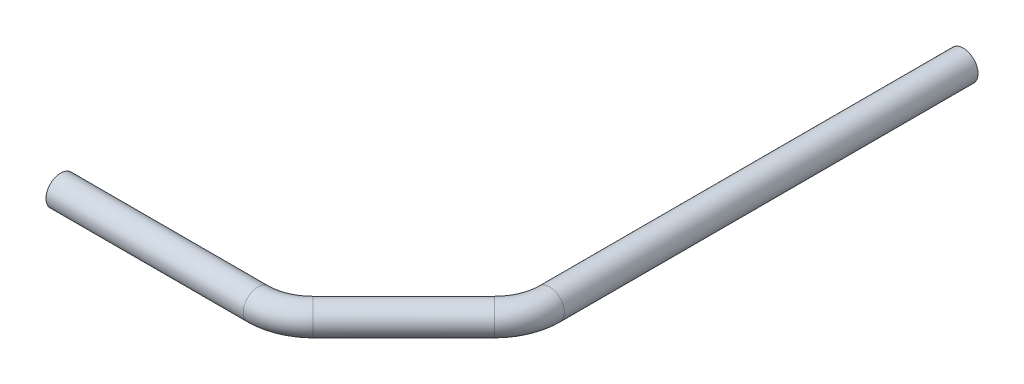
ISO-10303-21;
HEADER;
FILE_DESCRIPTION(('STEP AP214'),'2;1');
FILE_NAME('part.step','',(''),(''),'','','');
FILE_SCHEMA(('AUTOMOTIVE_DESIGN { 1 0 10303 214 1 1 1 1 }'));
ENDSEC;
DATA;
#1=APPLICATION_CONTEXT('core data for automotive mechanical design processes');
#2=APPLICATION_PROTOCOL_DEFINITION('international standard','automotive_design',2000,#1);
#3=PRODUCT_CONTEXT('',#1,'mechanical');
#4=PRODUCT('Part','Part','',(#3));
#5=PRODUCT_RELATED_PRODUCT_CATEGORY('part','',(#4));
#6=PRODUCT_DEFINITION_FORMATION('','',#4);
#7=PRODUCT_DEFINITION_CONTEXT('part definition',#1,'design');
#8=PRODUCT_DEFINITION('design','',#6,#7);
#9=PRODUCT_DEFINITION_SHAPE('','',#8);
#10=(LENGTH_UNIT() NAMED_UNIT(*) SI_UNIT(.MILLI.,.METRE.));
#11=(NAMED_UNIT(*) PLANE_ANGLE_UNIT() SI_UNIT($,.RADIAN.));
#12=(NAMED_UNIT(*) SI_UNIT($,.STERADIAN.) SOLID_ANGLE_UNIT());
#13=UNCERTAINTY_MEASURE_WITH_UNIT(LENGTH_MEASURE(1.E-05),#10,'distance_accuracy_value','');
#14=(GEOMETRIC_REPRESENTATION_CONTEXT(3) GLOBAL_UNCERTAINTY_ASSIGNED_CONTEXT((#13)) GLOBAL_UNIT_ASSIGNED_CONTEXT((#10,
#11,#12)) REPRESENTATION_CONTEXT('',''));
#15=CARTESIAN_POINT('',(0.,0.,0.));
#16=DIRECTION('',(0.,0.,1.));
#17=DIRECTION('',(1.,0.,0.));
#18=AXIS2_PLACEMENT_3D('',#15,#16,#17);
#19=CARTESIAN_POINT('',(2.52531112179441,1.45186513402315,0.340051656719717));
#20=DIRECTION('',(-1.,0.,0.));
#21=DIRECTION('',(0.,0.,1.));
#22=AXIS2_PLACEMENT_3D('',#19,#20,#21);
#23=PLANE('',#22);
#24=CARTESIAN_POINT('',(2.52531112179441,1.45186513402315,0.340051656719717));
#25=DIRECTION('',(1.,0.,0.));
#26=DIRECTION('',(0.,0.,-1.));
#27=AXIS2_PLACEMENT_3D('',#24,#25,#26);
#28=CIRCLE('',#27,0.535);
#29=CARTESIAN_POINT('',(2.52531112179441,1.45186513402315,-0.194948343280283));
#30=VERTEX_POINT('',#29);
#31=EDGE_CURVE('E64',#30,#30,#28,.T.);
#32=ORIENTED_EDGE('',*,*,#31,.F.);
#33=EDGE_LOOP('',(#32));
#34=FACE_BOUND('',#33,.T.);
#35=ADVANCED_FACE('F15',(#34),#23,.T.);
#36=CARTESIAN_POINT('',(2.52531112179441,1.45186513402315,0.340051656719717));
#37=DIRECTION('',(1.,0.,0.));
#38=DIRECTION('',(0.,0.,-1.));
#39=AXIS2_PLACEMENT_3D('',#36,#37,#38);
#40=CYLINDRICAL_SURFACE('',#39,0.535);
#41=ORIENTED_EDGE('',*,*,#31,.T.);
#42=EDGE_LOOP('',(#41));
#43=FACE_BOUND('',#42,.T.);
#44=CARTESIAN_POINT('',(9.69688399704822,1.45186513402315,0.34005165671972));
#45=DIRECTION('',(1.,0.,0.));
#46=DIRECTION('',(0.,0.,1.));
#47=AXIS2_PLACEMENT_3D('',#44,#45,#46);
#48=CIRCLE('',#47,0.535);
#49=CARTESIAN_POINT('',(9.69688399704822,1.45186513402315,0.87505165671972));
#50=VERTEX_POINT('',#49);
#51=EDGE_CURVE('E60',#50,#50,#48,.T.);
#52=ORIENTED_EDGE('',*,*,#51,.F.);
#53=EDGE_LOOP('',(#52));
#54=FACE_BOUND('',#53,.T.);
#55=ADVANCED_FACE('F53',(#43,#54),#40,.T.);
#56=CARTESIAN_POINT('',(9.69688399704822,1.45186513402315,-1.65994834328028));
#57=DIRECTION('',(0.,1.,0.));
#58=DIRECTION('',(0.,0.,1.));
#59=AXIS2_PLACEMENT_3D('',#56,#57,#58);
#60=TOROIDAL_SURFACE('',#59,2.,0.535);
#61=ORIENTED_EDGE('',*,*,#51,.T.);
#62=EDGE_LOOP('',(#61));
#63=FACE_BOUND('',#62,.T.);
#64=CARTESIAN_POINT('',(11.1110975594213,1.45186513402315,-0.24573478090719));
#65=DIRECTION('',(0.707106781186547,0.,-0.707106781186548));
#66=DIRECTION('',(-0.707106781186548,0.,-0.707106781186547));
#67=AXIS2_PLACEMENT_3D('',#64,#65,#66);
#68=CIRCLE('',#67,0.535);
#69=CARTESIAN_POINT('',(10.7327954314865,1.45186513402315,-0.624036908841993));
#70=VERTEX_POINT('',#69);
#71=EDGE_CURVE('E63',#70,#70,#68,.T.);
#72=ORIENTED_EDGE('',*,*,#71,.F.);
#73=EDGE_LOOP('',(#72));
#74=FACE_BOUND('',#73,.T.);
#75=ADVANCED_FACE('F49',(#63,#74),#60,.T.);
#76=CARTESIAN_POINT('',(11.1110975594213,1.45186513402315,-0.245734780907189));
#77=DIRECTION('',(0.707106781186547,0.,-0.707106781186548));
#78=DIRECTION('',(-0.707106781186548,0.,-0.707106781186547));
#79=AXIS2_PLACEMENT_3D('',#76,#77,#78);
#80=CYLINDRICAL_SURFACE('',#79,0.535);
#81=ORIENTED_EDGE('',*,*,#71,.T.);
#82=EDGE_LOOP('',(#81));
#83=FACE_BOUND('',#82,.T.);
#84=CARTESIAN_POINT('',(14.4142137858905,1.45186513402315,-3.5488510073764));
#85=DIRECTION('',(0.707106781186544,0.,-0.707106781186551));
#86=DIRECTION('',(0.707106781186551,0.,0.707106781186544));
#87=AXIS2_PLACEMENT_3D('',#84,#85,#86);
#88=CIRCLE('',#87,0.535);
#89=CARTESIAN_POINT('',(14.7925159138253,1.45186513402315,-3.1705488794416));
#90=VERTEX_POINT('',#89);
#91=EDGE_CURVE('E27',#90,#90,#88,.T.);
#92=ORIENTED_EDGE('',*,*,#91,.F.);
#93=EDGE_LOOP('',(#92));
#94=FACE_BOUND('',#93,.T.);
#95=ADVANCED_FACE('F45',(#83,#94),#80,.T.);
#96=CARTESIAN_POINT('',(15.0000002235174,1.45186513402315,-20.));
#97=DIRECTION('',(0.,0.,1.));
#98=DIRECTION('',(1.,0.,0.));
#99=AXIS2_PLACEMENT_3D('',#96,#97,#98);
#100=PLANE('',#99);
#101=CARTESIAN_POINT('',(15.0000002235174,1.45186513402315,-20.));
#102=DIRECTION('',(0.,0.,-1.));
#103=DIRECTION('',(-1.,0.,0.));
#104=AXIS2_PLACEMENT_3D('',#101,#102,#103);
#105=CIRCLE('',#104,0.535);
#106=CARTESIAN_POINT('',(14.4650002235174,1.45186513402315,-20.));
#107=VERTEX_POINT('',#106);
#108=EDGE_CURVE('E22',#107,#107,#105,.F.);
#109=ORIENTED_EDGE('',*,*,#108,.F.);
#110=EDGE_LOOP('',(#109));
#111=FACE_BOUND('',#110,.T.);
#112=ADVANCED_FACE('F41',(#111),#100,.F.);
#113=CARTESIAN_POINT('',(13.0000002235174,1.45186513402315,-4.96306456974948));
#114=DIRECTION('',(0.,1.,0.));
#115=DIRECTION('',(0.,0.,1.));
#116=AXIS2_PLACEMENT_3D('',#113,#114,#115);
#117=TOROIDAL_SURFACE('',#116,1.99999999999999,0.535);
#118=ORIENTED_EDGE('',*,*,#91,.T.);
#119=EDGE_LOOP('',(#118));
#120=FACE_BOUND('',#119,.T.);
#121=CARTESIAN_POINT('',(15.0000002235174,1.45186513402315,-4.96306456974948));
#122=DIRECTION('',(0.,0.,-1.));
#123=DIRECTION('',(-1.,0.,0.));
#124=AXIS2_PLACEMENT_3D('',#121,#122,#123);
#125=CIRCLE('',#124,0.535);
#126=CARTESIAN_POINT('',(14.4650002235174,1.45186513402315,-4.96306456974948));
#127=VERTEX_POINT('',#126);
#128=EDGE_CURVE('E10',#127,#127,#125,.T.);
#129=ORIENTED_EDGE('',*,*,#128,.F.);
#130=EDGE_LOOP('',(#129));
#131=FACE_BOUND('',#130,.T.);
#132=ADVANCED_FACE('F36',(#120,#131),#117,.T.);
#133=CARTESIAN_POINT('',(15.0000002235174,1.45186513402315,-4.96306456974947));
#134=DIRECTION('',(0.,0.,-1.));
#135=DIRECTION('',(-1.,0.,0.));
#136=AXIS2_PLACEMENT_3D('',#133,#134,#135);
#137=CYLINDRICAL_SURFACE('',#136,0.535);
#138=ORIENTED_EDGE('',*,*,#128,.T.);
#139=EDGE_LOOP('',(#138));
#140=FACE_BOUND('',#139,.T.);
#141=ORIENTED_EDGE('',*,*,#108,.T.);
#142=EDGE_LOOP('',(#141));
#143=FACE_BOUND('',#142,.T.);
#144=ADVANCED_FACE('F40',(#140,#143),#137,.T.);
#145=CLOSED_SHELL('',(#35,#55,#75,#95,#112,#132,#144));
#146=MANIFOLD_SOLID_BREP('B1',#145);
#147=ADVANCED_BREP_SHAPE_REPRESENTATION('',(#18,#146),#14);
#148=SHAPE_DEFINITION_REPRESENTATION(#9,#147);
ENDSEC;
END-ISO-10303-21;
